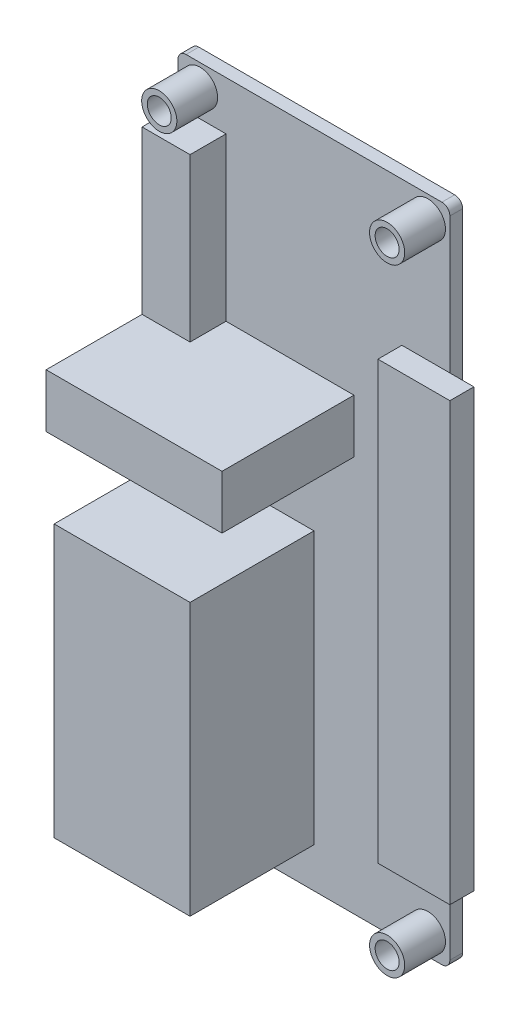
ISO-10303-21;
HEADER;
FILE_DESCRIPTION(('STEP AP214'),'2;1');
FILE_NAME('part.step','',(''),(''),'','','');
FILE_SCHEMA(('AUTOMOTIVE_DESIGN { 1 0 10303 214 1 1 1 1 }'));
ENDSEC;
DATA;
#1=APPLICATION_CONTEXT('core data for automotive mechanical design processes');
#2=APPLICATION_PROTOCOL_DEFINITION('international standard','automotive_design',2000,#1);
#3=PRODUCT_CONTEXT('',#1,'mechanical');
#4=PRODUCT('Part','Part','',(#3));
#5=PRODUCT_RELATED_PRODUCT_CATEGORY('part','',(#4));
#6=PRODUCT_DEFINITION_FORMATION('','',#4);
#7=PRODUCT_DEFINITION_CONTEXT('part definition',#1,'design');
#8=PRODUCT_DEFINITION('design','',#6,#7);
#9=PRODUCT_DEFINITION_SHAPE('','',#8);
#10=(LENGTH_UNIT() NAMED_UNIT(*) SI_UNIT(.MILLI.,.METRE.));
#11=(NAMED_UNIT(*) PLANE_ANGLE_UNIT() SI_UNIT($,.RADIAN.));
#12=(NAMED_UNIT(*) SI_UNIT($,.STERADIAN.) SOLID_ANGLE_UNIT());
#13=UNCERTAINTY_MEASURE_WITH_UNIT(LENGTH_MEASURE(1.E-05),#10,'distance_accuracy_value','');
#14=(GEOMETRIC_REPRESENTATION_CONTEXT(3) GLOBAL_UNCERTAINTY_ASSIGNED_CONTEXT((#13)) GLOBAL_UNIT_ASSIGNED_CONTEXT((#10,
#11,#12)) REPRESENTATION_CONTEXT('',''));
#15=CARTESIAN_POINT('',(0.,0.,0.));
#16=DIRECTION('',(0.,0.,1.));
#17=DIRECTION('',(1.,0.,0.));
#18=AXIS2_PLACEMENT_3D('',#15,#16,#17);
#19=CARTESIAN_POINT('',(16.,-40.3,1.6));
#20=DIRECTION('',(0.,0.,1.));
#21=DIRECTION('',(1.,0.,0.));
#22=AXIS2_PLACEMENT_3D('',#19,#20,#21);
#23=PLANE('',#22);
#24=CARTESIAN_POINT('',(-14.25,-38.6,1.6));
#25=DIRECTION('',(0.,0.,1.));
#26=DIRECTION('',(1.,0.,0.));
#27=AXIS2_PLACEMENT_3D('',#24,#25,#26);
#28=CIRCLE('',#27,2.2);
#29=CARTESIAN_POINT('',(-12.05,-38.6,1.6));
#30=VERTEX_POINT('',#29);
#31=EDGE_CURVE('E302',#30,#30,#28,.T.);
#32=ORIENTED_EDGE('',*,*,#31,.F.);
#33=EDGE_LOOP('',(#32));
#34=FACE_BOUND('',#33,.T.);
#35=CARTESIAN_POINT('',(-14.25,38.6,1.6));
#36=DIRECTION('',(0.,0.,1.));
#37=DIRECTION('',(1.,0.,0.));
#38=AXIS2_PLACEMENT_3D('',#35,#36,#37);
#39=CIRCLE('',#38,2.2);
#40=CARTESIAN_POINT('',(-12.05,38.6,1.6));
#41=VERTEX_POINT('',#40);
#42=EDGE_CURVE('E329',#41,#41,#39,.T.);
#43=ORIENTED_EDGE('',*,*,#42,.F.);
#44=EDGE_LOOP('',(#43));
#45=FACE_BOUND('',#44,.T.);
#46=CARTESIAN_POINT('',(14.25,38.6,1.6));
#47=DIRECTION('',(0.,0.,1.));
#48=DIRECTION('',(1.,0.,0.));
#49=AXIS2_PLACEMENT_3D('',#46,#47,#48);
#50=CIRCLE('',#49,2.2);
#51=CARTESIAN_POINT('',(16.45,38.6,1.6));
#52=VERTEX_POINT('',#51);
#53=EDGE_CURVE('E314',#52,#52,#50,.T.);
#54=ORIENTED_EDGE('',*,*,#53,.F.);
#55=EDGE_LOOP('',(#54));
#56=FACE_BOUND('',#55,.T.);
#57=CARTESIAN_POINT('',(14.25,-38.6,1.6));
#58=DIRECTION('',(0.,0.,1.));
#59=DIRECTION('',(1.,0.,0.));
#60=AXIS2_PLACEMENT_3D('',#57,#58,#59);
#61=CIRCLE('',#60,2.2);
#62=CARTESIAN_POINT('',(16.45,-38.6,1.6));
#63=VERTEX_POINT('',#62);
#64=EDGE_CURVE('E290',#63,#63,#61,.T.);
#65=ORIENTED_EDGE('',*,*,#64,.F.);
#66=EDGE_LOOP('',(#65));
#67=FACE_BOUND('',#66,.T.);
#68=DIRECTION('',(-1.,0.,0.));
#69=VECTOR('',#68,1.);
#70=CARTESIAN_POINT('',(-11.,35.2,1.6));
#71=LINE('',#70,#69);
#72=CARTESIAN_POINT('',(-11.,35.2,1.6));
#73=VERTEX_POINT('',#72);
#74=CARTESIAN_POINT('',(-17.,35.2,1.6));
#75=VERTEX_POINT('',#74);
#76=EDGE_CURVE('E238',#73,#75,#71,.T.);
#77=ORIENTED_EDGE('',*,*,#76,.F.);
#78=DIRECTION('',(0.,1.,0.));
#79=VECTOR('',#78,1.);
#80=CARTESIAN_POINT('',(-11.,14.9,1.6));
#81=LINE('',#80,#79);
#82=CARTESIAN_POINT('',(-11.,14.9,1.6));
#83=VERTEX_POINT('',#82);
#84=EDGE_CURVE('E242',#83,#73,#81,.T.);
#85=ORIENTED_EDGE('',*,*,#84,.F.);
#86=DIRECTION('',(-1.,0.,0.));
#87=VECTOR('',#86,1.);
#88=CARTESIAN_POINT('',(-17.,14.9,1.6));
#89=LINE('',#88,#87);
#90=CARTESIAN_POINT('',(5.,14.9,1.6));
#91=VERTEX_POINT('',#90);
#92=EDGE_CURVE('E260',#91,#83,#89,.T.);
#93=ORIENTED_EDGE('',*,*,#92,.F.);
#94=DIRECTION('',(0.,1.,0.));
#95=VECTOR('',#94,1.);
#96=CARTESIAN_POINT('',(5.,14.9,1.6));
#97=LINE('',#96,#95);
#98=CARTESIAN_POINT('',(5.,8.20000000000001,1.6));
#99=VERTEX_POINT('',#98);
#100=EDGE_CURVE('E249',#99,#91,#97,.T.);
#101=ORIENTED_EDGE('',*,*,#100,.F.);
#102=DIRECTION('',(1.,0.,0.));
#103=VECTOR('',#102,1.);
#104=CARTESIAN_POINT('',(-17.,8.20000000000001,1.6));
#105=LINE('',#104,#103);
#106=CARTESIAN_POINT('',(-10.,8.20000000000001,1.6));
#107=VERTEX_POINT('',#106);
#108=EDGE_CURVE('E245',#107,#99,#105,.T.);
#109=ORIENTED_EDGE('',*,*,#108,.F.);
#110=DIRECTION('',(0.,1.,0.));
#111=VECTOR('',#110,1.);
#112=CARTESIAN_POINT('',(-10.,8.20000000000001,1.6));
#113=LINE('',#112,#111);
#114=CARTESIAN_POINT('',(-10.,-2.3,1.6));
#115=VERTEX_POINT('',#114);
#116=EDGE_CURVE('E334',#115,#107,#113,.T.);
#117=ORIENTED_EDGE('',*,*,#116,.F.);
#118=DIRECTION('',(-1.,0.,0.));
#119=VECTOR('',#118,1.);
#120=CARTESIAN_POINT('',(-17.,-2.3,1.6));
#121=LINE('',#120,#119);
#122=CARTESIAN_POINT('',(0.,-2.3,1.6));
#123=VERTEX_POINT('',#122);
#124=EDGE_CURVE('E365',#123,#115,#121,.T.);
#125=ORIENTED_EDGE('',*,*,#124,.F.);
#126=DIRECTION('',(0.,1.,0.));
#127=VECTOR('',#126,1.);
#128=CARTESIAN_POINT('',(0.,-2.3,1.6));
#129=LINE('',#128,#127);
#130=CARTESIAN_POINT('',(0.,-36.3,1.6));
#131=VERTEX_POINT('',#130);
#132=EDGE_CURVE('E378',#131,#123,#129,.T.);
#133=ORIENTED_EDGE('',*,*,#132,.F.);
#134=DIRECTION('',(1.,0.,0.));
#135=VECTOR('',#134,1.);
#136=CARTESIAN_POINT('',(-17.,-36.3,1.6));
#137=LINE('',#136,#135);
#138=CARTESIAN_POINT('',(-17.,-36.3,1.6));
#139=VERTEX_POINT('',#138);
#140=EDGE_CURVE('E359',#139,#131,#137,.T.);
#141=ORIENTED_EDGE('',*,*,#140,.F.);
#142=DIRECTION('',(0.,-1.,0.));
#143=VECTOR('',#142,1.);
#144=CARTESIAN_POINT('',(-17.,-40.3,1.6));
#145=LINE('',#144,#143);
#146=CARTESIAN_POINT('',(-17.,-40.3,1.6));
#147=VERTEX_POINT('',#146);
#148=EDGE_CURVE('E479',#139,#147,#145,.T.);
#149=ORIENTED_EDGE('',*,*,#148,.T.);
#150=CARTESIAN_POINT('',(-16.,-40.3,1.6));
#151=DIRECTION('',(0.,0.,1.));
#152=DIRECTION('',(-1.,0.,0.));
#153=AXIS2_PLACEMENT_3D('',#150,#151,#152);
#154=CIRCLE('',#153,1.);
#155=CARTESIAN_POINT('',(-16.,-41.3,1.6));
#156=VERTEX_POINT('',#155);
#157=EDGE_CURVE('E484',#147,#156,#154,.T.);
#158=ORIENTED_EDGE('',*,*,#157,.T.);
#159=DIRECTION('',(1.,0.,0.));
#160=VECTOR('',#159,1.);
#161=CARTESIAN_POINT('',(-16.,-41.3,1.6));
#162=LINE('',#161,#160);
#163=CARTESIAN_POINT('',(16.,-41.3,1.6));
#164=VERTEX_POINT('',#163);
#165=EDGE_CURVE('E487',#156,#164,#162,.T.);
#166=ORIENTED_EDGE('',*,*,#165,.T.);
#167=CARTESIAN_POINT('',(16.,-40.3,1.6));
#168=DIRECTION('',(0.,0.,1.));
#169=DIRECTION('',(1.,0.,0.));
#170=AXIS2_PLACEMENT_3D('',#167,#168,#169);
#171=CIRCLE('',#170,1.);
#172=CARTESIAN_POINT('',(17.,-40.3,1.6));
#173=VERTEX_POINT('',#172);
#174=EDGE_CURVE('E460',#164,#173,#171,.T.);
#175=ORIENTED_EDGE('',*,*,#174,.T.);
#176=DIRECTION('',(0.,1.,0.));
#177=VECTOR('',#176,1.);
#178=CARTESIAN_POINT('',(17.,-40.3,1.6));
#179=LINE('',#178,#177);
#180=CARTESIAN_POINT('',(17.,-31.3,1.6));
#181=VERTEX_POINT('',#180);
#182=EDGE_CURVE('E466',#173,#181,#179,.T.);
#183=ORIENTED_EDGE('',*,*,#182,.T.);
#184=DIRECTION('',(1.,0.,0.));
#185=VECTOR('',#184,1.);
#186=CARTESIAN_POINT('',(11.,-31.3,1.6));
#187=LINE('',#186,#185);
#188=CARTESIAN_POINT('',(11.,-31.3,1.6));
#189=VERTEX_POINT('',#188);
#190=EDGE_CURVE('E419',#189,#181,#187,.T.);
#191=ORIENTED_EDGE('',*,*,#190,.F.);
#192=DIRECTION('',(0.,-1.,0.));
#193=VECTOR('',#192,1.);
#194=CARTESIAN_POINT('',(11.,23.3,1.6));
#195=LINE('',#194,#193);
#196=CARTESIAN_POINT('',(11.,23.3,1.6));
#197=VERTEX_POINT('',#196);
#198=EDGE_CURVE('E400',#197,#189,#195,.T.);
#199=ORIENTED_EDGE('',*,*,#198,.F.);
#200=DIRECTION('',(-1.,0.,0.));
#201=VECTOR('',#200,1.);
#202=CARTESIAN_POINT('',(11.,23.3,1.6));
#203=LINE('',#202,#201);
#204=CARTESIAN_POINT('',(17.,23.3,1.6));
#205=VERTEX_POINT('',#204);
#206=EDGE_CURVE('E11',#205,#197,#203,.T.);
#207=ORIENTED_EDGE('',*,*,#206,.F.);
#208=CARTESIAN_POINT('',(17.,40.3,1.6));
#209=VERTEX_POINT('',#208);
#210=EDGE_CURVE('E464',#205,#209,#179,.T.);
#211=ORIENTED_EDGE('',*,*,#210,.T.);
#212=CARTESIAN_POINT('',(16.,40.3,1.6));
#213=DIRECTION('',(0.,0.,1.));
#214=DIRECTION('',(-1.,0.,0.));
#215=AXIS2_PLACEMENT_3D('',#212,#213,#214);
#216=CIRCLE('',#215,1.);
#217=CARTESIAN_POINT('',(16.,41.3,1.6));
#218=VERTEX_POINT('',#217);
#219=EDGE_CURVE('E469',#209,#218,#216,.T.);
#220=ORIENTED_EDGE('',*,*,#219,.T.);
#221=DIRECTION('',(-1.,0.,0.));
#222=VECTOR('',#221,1.);
#223=CARTESIAN_POINT('',(-16.,41.3,1.6));
#224=LINE('',#223,#222);
#225=CARTESIAN_POINT('',(-16.,41.3,1.6));
#226=VERTEX_POINT('',#225);
#227=EDGE_CURVE('E473',#218,#226,#224,.T.);
#228=ORIENTED_EDGE('',*,*,#227,.T.);
#229=CARTESIAN_POINT('',(-16.,40.3,1.6));
#230=DIRECTION('',(0.,0.,1.));
#231=DIRECTION('',(-1.,0.,0.));
#232=AXIS2_PLACEMENT_3D('',#229,#230,#231);
#233=CIRCLE('',#232,1.);
#234=CARTESIAN_POINT('',(-17.,40.3,1.6));
#235=VERTEX_POINT('',#234);
#236=EDGE_CURVE('E476',#226,#235,#233,.T.);
#237=ORIENTED_EDGE('',*,*,#236,.T.);
#238=EDGE_CURVE('E480',#235,#75,#145,.T.);
#239=ORIENTED_EDGE('',*,*,#238,.T.);
#240=EDGE_LOOP('',(#77,#85,#93,#101,#109,#117,#125,#133,#141,#149,#158,#166,#175,#183,#191,#199,
#207,#211,#220,#228,#237,#239));
#241=FACE_BOUND('',#240,.T.);
#242=ADVANCED_FACE('F45',(#34,#45,#56,#67,#241),#23,.T.);
#243=CARTESIAN_POINT('',(-17.,14.9,18.1));
#244=DIRECTION('',(0.,-1.,0.));
#245=DIRECTION('',(0.,0.,-1.));
#246=AXIS2_PLACEMENT_3D('',#243,#244,#245);
#247=PLANE('',#246);
#248=DIRECTION('',(0.,0.,-1.));
#249=VECTOR('',#248,1.);
#250=CARTESIAN_POINT('',(-11.,14.9,6.1));
#251=LINE('',#250,#249);
#252=CARTESIAN_POINT('',(-11.,14.9,6.1));
#253=VERTEX_POINT('',#252);
#254=EDGE_CURVE('E251',#253,#83,#251,.T.);
#255=ORIENTED_EDGE('',*,*,#254,.F.);
#256=DIRECTION('',(1.,0.,0.));
#257=VECTOR('',#256,1.);
#258=CARTESIAN_POINT('',(-11.,14.9,6.1));
#259=LINE('',#258,#257);
#260=CARTESIAN_POINT('',(-17.,14.9,6.1));
#261=VERTEX_POINT('',#260);
#262=EDGE_CURVE('E234',#261,#253,#259,.T.);
#263=ORIENTED_EDGE('',*,*,#262,.F.);
#264=DIRECTION('',(0.,0.,-1.));
#265=VECTOR('',#264,1.);
#266=CARTESIAN_POINT('',(-17.,14.9,18.1));
#267=LINE('',#266,#265);
#268=CARTESIAN_POINT('',(-17.,14.9,18.1));
#269=VERTEX_POINT('',#268);
#270=EDGE_CURVE('E268',#269,#261,#267,.T.);
#271=ORIENTED_EDGE('',*,*,#270,.F.);
#272=DIRECTION('',(-1.,0.,0.));
#273=VECTOR('',#272,1.);
#274=CARTESIAN_POINT('',(-17.,14.9,18.1));
#275=LINE('',#274,#273);
#276=CARTESIAN_POINT('',(5.,14.9,18.1));
#277=VERTEX_POINT('',#276);
#278=EDGE_CURVE('E266',#277,#269,#275,.T.);
#279=ORIENTED_EDGE('',*,*,#278,.F.);
#280=DIRECTION('',(0.,0.,-1.));
#281=VECTOR('',#280,1.);
#282=CARTESIAN_POINT('',(5.,14.9,18.1));
#283=LINE('',#282,#281);
#284=EDGE_CURVE('E278',#277,#91,#283,.T.);
#285=ORIENTED_EDGE('',*,*,#284,.T.);
#286=ORIENTED_EDGE('',*,*,#92,.T.);
#287=EDGE_LOOP('',(#255,#263,#271,#279,#285,#286));
#288=FACE_BOUND('',#287,.T.);
#289=ADVANCED_FACE('F615',(#288),#247,.F.);
#290=CARTESIAN_POINT('',(-17.,-2.3,17.1));
#291=DIRECTION('',(0.,-1.,0.));
#292=DIRECTION('',(0.,0.,-1.));
#293=AXIS2_PLACEMENT_3D('',#290,#291,#292);
#294=PLANE('',#293);
#295=DIRECTION('',(0.,0.,-1.));
#296=VECTOR('',#295,1.);
#297=CARTESIAN_POINT('',(-10.,-2.3,5.1));
#298=LINE('',#297,#296);
#299=CARTESIAN_POINT('',(-10.,-2.3,5.1));
#300=VERTEX_POINT('',#299);
#301=EDGE_CURVE('E356',#300,#115,#298,.T.);
#302=ORIENTED_EDGE('',*,*,#301,.F.);
#303=DIRECTION('',(1.,0.,0.));
#304=VECTOR('',#303,1.);
#305=CARTESIAN_POINT('',(-17.,-2.3,5.1));
#306=LINE('',#305,#304);
#307=CARTESIAN_POINT('',(-17.,-2.3,5.1));
#308=VERTEX_POINT('',#307);
#309=EDGE_CURVE('E340',#308,#300,#306,.T.);
#310=ORIENTED_EDGE('',*,*,#309,.F.);
#311=DIRECTION('',(0.,0.,-1.));
#312=VECTOR('',#311,1.);
#313=CARTESIAN_POINT('',(-17.,-2.3,17.1));
#314=LINE('',#313,#312);
#315=CARTESIAN_POINT('',(-17.,-2.3,17.1));
#316=VERTEX_POINT('',#315);
#317=EDGE_CURVE('E374',#316,#308,#314,.T.);
#318=ORIENTED_EDGE('',*,*,#317,.F.);
#319=DIRECTION('',(-1.,0.,0.));
#320=VECTOR('',#319,1.);
#321=CARTESIAN_POINT('',(-17.,-2.3,17.1));
#322=LINE('',#321,#320);
#323=CARTESIAN_POINT('',(0.,-2.3,17.1));
#324=VERTEX_POINT('',#323);
#325=EDGE_CURVE('E371',#324,#316,#322,.T.);
#326=ORIENTED_EDGE('',*,*,#325,.F.);
#327=DIRECTION('',(0.,0.,-1.));
#328=VECTOR('',#327,1.);
#329=CARTESIAN_POINT('',(0.,-2.3,17.1));
#330=LINE('',#329,#328);
#331=EDGE_CURVE('E388',#324,#123,#330,.T.);
#332=ORIENTED_EDGE('',*,*,#331,.T.);
#333=ORIENTED_EDGE('',*,*,#124,.T.);
#334=EDGE_LOOP('',(#302,#310,#318,#326,#332,#333));
#335=FACE_BOUND('',#334,.T.);
#336=ADVANCED_FACE('F623',(#335),#294,.F.);
#337=CARTESIAN_POINT('',(16.,-40.3,0.));
#338=DIRECTION('',(0.,0.,1.));
#339=DIRECTION('',(1.,0.,0.));
#340=AXIS2_PLACEMENT_3D('',#337,#338,#339);
#341=PLANE('',#340);
#342=CARTESIAN_POINT('',(16.,-40.3,0.));
#343=DIRECTION('',(0.,0.,1.));
#344=DIRECTION('',(1.,0.,0.));
#345=AXIS2_PLACEMENT_3D('',#342,#343,#344);
#346=CIRCLE('',#345,1.);
#347=CARTESIAN_POINT('',(16.,-41.3,0.));
#348=VERTEX_POINT('',#347);
#349=CARTESIAN_POINT('',(17.,-40.3,0.));
#350=VERTEX_POINT('',#349);
#351=EDGE_CURVE('E459',#348,#350,#346,.T.);
#352=ORIENTED_EDGE('',*,*,#351,.F.);
#353=DIRECTION('',(1.,0.,0.));
#354=VECTOR('',#353,1.);
#355=CARTESIAN_POINT('',(-16.,-41.3,0.));
#356=LINE('',#355,#354);
#357=CARTESIAN_POINT('',(-16.,-41.3,0.));
#358=VERTEX_POINT('',#357);
#359=EDGE_CURVE('E465',#358,#348,#356,.T.);
#360=ORIENTED_EDGE('',*,*,#359,.F.);
#361=CARTESIAN_POINT('',(-16.,-40.3,0.));
#362=DIRECTION('',(0.,0.,1.));
#363=DIRECTION('',(-1.,0.,0.));
#364=AXIS2_PLACEMENT_3D('',#361,#362,#363);
#365=CIRCLE('',#364,1.);
#366=CARTESIAN_POINT('',(-17.,-40.3,0.));
#367=VERTEX_POINT('',#366);
#368=EDGE_CURVE('E509',#367,#358,#365,.T.);
#369=ORIENTED_EDGE('',*,*,#368,.F.);
#370=DIRECTION('',(0.,-1.,0.));
#371=VECTOR('',#370,1.);
#372=CARTESIAN_POINT('',(-17.,-40.3,0.));
#373=LINE('',#372,#371);
#374=CARTESIAN_POINT('',(-17.,40.3,0.));
#375=VERTEX_POINT('',#374);
#376=EDGE_CURVE('E506',#375,#367,#373,.T.);
#377=ORIENTED_EDGE('',*,*,#376,.F.);
#378=CARTESIAN_POINT('',(-16.,40.3,0.));
#379=DIRECTION('',(0.,0.,1.));
#380=DIRECTION('',(-1.,0.,0.));
#381=AXIS2_PLACEMENT_3D('',#378,#379,#380);
#382=CIRCLE('',#381,1.);
#383=CARTESIAN_POINT('',(-16.,41.3,0.));
#384=VERTEX_POINT('',#383);
#385=EDGE_CURVE('E503',#384,#375,#382,.T.);
#386=ORIENTED_EDGE('',*,*,#385,.F.);
#387=DIRECTION('',(-1.,0.,0.));
#388=VECTOR('',#387,1.);
#389=CARTESIAN_POINT('',(-16.,41.3,0.));
#390=LINE('',#389,#388);
#391=CARTESIAN_POINT('',(16.,41.3,0.));
#392=VERTEX_POINT('',#391);
#393=EDGE_CURVE('E500',#392,#384,#390,.T.);
#394=ORIENTED_EDGE('',*,*,#393,.F.);
#395=CARTESIAN_POINT('',(16.,40.3,0.));
#396=DIRECTION('',(0.,0.,1.));
#397=DIRECTION('',(-1.,0.,0.));
#398=AXIS2_PLACEMENT_3D('',#395,#396,#397);
#399=CIRCLE('',#398,1.);
#400=CARTESIAN_POINT('',(17.,40.3,0.));
#401=VERTEX_POINT('',#400);
#402=EDGE_CURVE('E497',#401,#392,#399,.T.);
#403=ORIENTED_EDGE('',*,*,#402,.F.);
#404=DIRECTION('',(0.,1.,0.));
#405=VECTOR('',#404,1.);
#406=CARTESIAN_POINT('',(17.,-40.3,0.));
#407=LINE('',#406,#405);
#408=EDGE_CURVE('E494',#350,#401,#407,.T.);
#409=ORIENTED_EDGE('',*,*,#408,.F.);
#410=EDGE_LOOP('',(#352,#360,#369,#377,#386,#394,#403,#409));
#411=FACE_BOUND('',#410,.T.);
#412=CARTESIAN_POINT('',(-14.25,38.6,0.));
#413=DIRECTION('',(0.,0.,1.));
#414=DIRECTION('',(1.,0.,0.));
#415=AXIS2_PLACEMENT_3D('',#412,#413,#414);
#416=CIRCLE('',#415,1.5);
#417=CARTESIAN_POINT('',(-12.75,38.6,0.));
#418=VERTEX_POINT('',#417);
#419=EDGE_CURVE('E455',#418,#418,#416,.T.);
#420=ORIENTED_EDGE('',*,*,#419,.T.);
#421=EDGE_LOOP('',(#420));
#422=FACE_BOUND('',#421,.T.);
#423=CARTESIAN_POINT('',(14.25,38.6,0.));
#424=DIRECTION('',(0.,0.,1.));
#425=DIRECTION('',(1.,0.,0.));
#426=AXIS2_PLACEMENT_3D('',#423,#424,#425);
#427=CIRCLE('',#426,1.5);
#428=CARTESIAN_POINT('',(15.75,38.6,0.));
#429=VERTEX_POINT('',#428);
#430=EDGE_CURVE('E451',#429,#429,#427,.T.);
#431=ORIENTED_EDGE('',*,*,#430,.T.);
#432=EDGE_LOOP('',(#431));
#433=FACE_BOUND('',#432,.T.);
#434=CARTESIAN_POINT('',(-14.25,-38.6,0.));
#435=DIRECTION('',(0.,0.,1.));
#436=DIRECTION('',(1.,0.,0.));
#437=AXIS2_PLACEMENT_3D('',#434,#435,#436);
#438=CIRCLE('',#437,1.5);
#439=CARTESIAN_POINT('',(-12.75,-38.6,0.));
#440=VERTEX_POINT('',#439);
#441=EDGE_CURVE('E447',#440,#440,#438,.T.);
#442=ORIENTED_EDGE('',*,*,#441,.T.);
#443=EDGE_LOOP('',(#442));
#444=FACE_BOUND('',#443,.T.);
#445=CARTESIAN_POINT('',(14.25,-38.6,0.));
#446=DIRECTION('',(0.,0.,1.));
#447=DIRECTION('',(1.,0.,0.));
#448=AXIS2_PLACEMENT_3D('',#445,#446,#447);
#449=CIRCLE('',#448,1.5);
#450=CARTESIAN_POINT('',(15.75,-38.6,0.));
#451=VERTEX_POINT('',#450);
#452=EDGE_CURVE('E443',#451,#451,#449,.T.);
#453=ORIENTED_EDGE('',*,*,#452,.T.);
#454=EDGE_LOOP('',(#453));
#455=FACE_BOUND('',#454,.T.);
#456=ADVANCED_FACE('F555',(#411,#422,#433,#444,#455),#341,.F.);
#457=CARTESIAN_POINT('',(16.,-40.3,1.6));
#458=DIRECTION('',(0.,0.,-1.));
#459=DIRECTION('',(-1.,0.,0.));
#460=AXIS2_PLACEMENT_3D('',#457,#458,#459);
#461=CYLINDRICAL_SURFACE('',#460,1.);
#462=ORIENTED_EDGE('',*,*,#351,.T.);
#463=DIRECTION('',(0.,0.,-1.));
#464=VECTOR('',#463,1.);
#465=CARTESIAN_POINT('',(17.,-40.3,1.6));
#466=LINE('',#465,#464);
#467=EDGE_CURVE('E49',#173,#350,#466,.T.);
#468=ORIENTED_EDGE('',*,*,#467,.F.);
#469=ORIENTED_EDGE('',*,*,#174,.F.);
#470=DIRECTION('',(0.,0.,-1.));
#471=VECTOR('',#470,1.);
#472=CARTESIAN_POINT('',(16.,-41.3,1.6));
#473=LINE('',#472,#471);
#474=EDGE_CURVE('E490',#164,#348,#473,.T.);
#475=ORIENTED_EDGE('',*,*,#474,.T.);
#476=EDGE_LOOP('',(#462,#468,#469,#475));
#477=FACE_BOUND('',#476,.T.);
#478=ADVANCED_FACE('F47',(#477),#461,.T.);
#479=CARTESIAN_POINT('',(17.,-40.3,1.6));
#480=DIRECTION('',(-1.,0.,0.));
#481=DIRECTION('',(0.,0.,1.));
#482=AXIS2_PLACEMENT_3D('',#479,#480,#481);
#483=PLANE('',#482);
#484=ORIENTED_EDGE('',*,*,#408,.T.);
#485=DIRECTION('',(0.,0.,-1.));
#486=VECTOR('',#485,1.);
#487=CARTESIAN_POINT('',(17.,40.3,1.6));
#488=LINE('',#487,#486);
#489=EDGE_CURVE('E536',#209,#401,#488,.T.);
#490=ORIENTED_EDGE('',*,*,#489,.F.);
#491=ORIENTED_EDGE('',*,*,#210,.F.);
#492=EDGE_CURVE('E470',#181,#205,#179,.T.);
#493=ORIENTED_EDGE('',*,*,#492,.F.);
#494=ORIENTED_EDGE('',*,*,#182,.F.);
#495=ORIENTED_EDGE('',*,*,#467,.T.);
#496=EDGE_LOOP('',(#484,#490,#491,#493,#494,#495));
#497=FACE_BOUND('',#496,.T.);
#498=ADVANCED_FACE('F547',(#497),#483,.F.);
#499=CARTESIAN_POINT('',(16.,40.3,1.6));
#500=DIRECTION('',(0.,0.,-1.));
#501=DIRECTION('',(-1.,0.,0.));
#502=AXIS2_PLACEMENT_3D('',#499,#500,#501);
#503=CYLINDRICAL_SURFACE('',#502,1.);
#504=ORIENTED_EDGE('',*,*,#402,.T.);
#505=DIRECTION('',(0.,0.,-1.));
#506=VECTOR('',#505,1.);
#507=CARTESIAN_POINT('',(16.,41.3,1.6));
#508=LINE('',#507,#506);
#509=EDGE_CURVE('E533',#218,#392,#508,.T.);
#510=ORIENTED_EDGE('',*,*,#509,.F.);
#511=ORIENTED_EDGE('',*,*,#219,.F.);
#512=ORIENTED_EDGE('',*,*,#489,.T.);
#513=EDGE_LOOP('',(#504,#510,#511,#512));
#514=FACE_BOUND('',#513,.T.);
#515=ADVANCED_FACE('F561',(#514),#503,.T.);
#516=CARTESIAN_POINT('',(-16.,41.3,1.6));
#517=DIRECTION('',(0.,-1.,0.));
#518=DIRECTION('',(0.,0.,-1.));
#519=AXIS2_PLACEMENT_3D('',#516,#517,#518);
#520=PLANE('',#519);
#521=ORIENTED_EDGE('',*,*,#393,.T.);
#522=DIRECTION('',(0.,0.,-1.));
#523=VECTOR('',#522,1.);
#524=CARTESIAN_POINT('',(-16.,41.3,1.6));
#525=LINE('',#524,#523);
#526=EDGE_CURVE('E529',#226,#384,#525,.T.);
#527=ORIENTED_EDGE('',*,*,#526,.F.);
#528=ORIENTED_EDGE('',*,*,#227,.F.);
#529=ORIENTED_EDGE('',*,*,#509,.T.);
#530=EDGE_LOOP('',(#521,#527,#528,#529));
#531=FACE_BOUND('',#530,.T.);
#532=ADVANCED_FACE('F564',(#531),#520,.F.);
#533=CARTESIAN_POINT('',(-16.,40.3,1.6));
#534=DIRECTION('',(0.,0.,-1.));
#535=DIRECTION('',(-1.,0.,0.));
#536=AXIS2_PLACEMENT_3D('',#533,#534,#535);
#537=CYLINDRICAL_SURFACE('',#536,1.);
#538=ORIENTED_EDGE('',*,*,#385,.T.);
#539=DIRECTION('',(0.,0.,-1.));
#540=VECTOR('',#539,1.);
#541=CARTESIAN_POINT('',(-17.,40.3,1.6));
#542=LINE('',#541,#540);
#543=EDGE_CURVE('E525',#235,#375,#542,.T.);
#544=ORIENTED_EDGE('',*,*,#543,.F.);
#545=ORIENTED_EDGE('',*,*,#236,.F.);
#546=ORIENTED_EDGE('',*,*,#526,.T.);
#547=EDGE_LOOP('',(#538,#544,#545,#546));
#548=FACE_BOUND('',#547,.T.);
#549=ADVANCED_FACE('F604',(#548),#537,.T.);
#550=CARTESIAN_POINT('',(-17.,-40.3,1.6));
#551=DIRECTION('',(1.,0.,0.));
#552=DIRECTION('',(0.,0.,-1.));
#553=AXIS2_PLACEMENT_3D('',#550,#551,#552);
#554=PLANE('',#553);
#555=ORIENTED_EDGE('',*,*,#376,.T.);
#556=DIRECTION('',(0.,0.,-1.));
#557=VECTOR('',#556,1.);
#558=CARTESIAN_POINT('',(-17.,-40.3,1.6));
#559=LINE('',#558,#557);
#560=EDGE_CURVE('E521',#147,#367,#559,.T.);
#561=ORIENTED_EDGE('',*,*,#560,.F.);
#562=ORIENTED_EDGE('',*,*,#148,.F.);
#563=DIRECTION('',(0.,0.,-1.));
#564=VECTOR('',#563,1.);
#565=CARTESIAN_POINT('',(-17.,-36.3,17.1));
#566=LINE('',#565,#564);
#567=CARTESIAN_POINT('',(-17.,-36.3,17.1));
#568=VERTEX_POINT('',#567);
#569=EDGE_CURVE('E396',#568,#139,#566,.T.);
#570=ORIENTED_EDGE('',*,*,#569,.F.);
#571=DIRECTION('',(0.,-1.,0.));
#572=VECTOR('',#571,1.);
#573=CARTESIAN_POINT('',(-17.,-2.3,17.1));
#574=LINE('',#573,#572);
#575=EDGE_CURVE('E360',#316,#568,#574,.T.);
#576=ORIENTED_EDGE('',*,*,#575,.F.);
#577=ORIENTED_EDGE('',*,*,#317,.T.);
#578=DIRECTION('',(0.,-1.,0.));
#579=VECTOR('',#578,1.);
#580=CARTESIAN_POINT('',(-17.,8.20000000000001,5.1));
#581=LINE('',#580,#579);
#582=CARTESIAN_POINT('',(-17.,8.20000000000001,5.1));
#583=VERTEX_POINT('',#582);
#584=EDGE_CURVE('E71',#583,#308,#581,.T.);
#585=ORIENTED_EDGE('',*,*,#584,.F.);
#586=DIRECTION('',(0.,0.,-1.));
#587=VECTOR('',#586,1.);
#588=CARTESIAN_POINT('',(-17.,8.20000000000001,18.1));
#589=LINE('',#588,#587);
#590=CARTESIAN_POINT('',(-17.,8.20000000000001,18.1));
#591=VERTEX_POINT('',#590);
#592=EDGE_CURVE('E286',#591,#583,#589,.T.);
#593=ORIENTED_EDGE('',*,*,#592,.F.);
#594=DIRECTION('',(0.,-1.,0.));
#595=VECTOR('',#594,1.);
#596=CARTESIAN_POINT('',(-17.,14.9,18.1));
#597=LINE('',#596,#595);
#598=EDGE_CURVE('E255',#269,#591,#597,.T.);
#599=ORIENTED_EDGE('',*,*,#598,.F.);
#600=ORIENTED_EDGE('',*,*,#270,.T.);
#601=DIRECTION('',(0.,-1.,0.));
#602=VECTOR('',#601,1.);
#603=CARTESIAN_POINT('',(-17.,14.9,6.1));
#604=LINE('',#603,#602);
#605=CARTESIAN_POINT('',(-17.,35.2,6.1));
#606=VERTEX_POINT('',#605);
#607=EDGE_CURVE('E63',#606,#261,#604,.T.);
#608=ORIENTED_EDGE('',*,*,#607,.F.);
#609=DIRECTION('',(0.,0.,-1.));
#610=VECTOR('',#609,1.);
#611=CARTESIAN_POINT('',(-17.,35.2,6.1));
#612=LINE('',#611,#610);
#613=EDGE_CURVE('E228',#606,#75,#612,.T.);
#614=ORIENTED_EDGE('',*,*,#613,.T.);
#615=ORIENTED_EDGE('',*,*,#238,.F.);
#616=ORIENTED_EDGE('',*,*,#543,.T.);
#617=EDGE_LOOP('',(#555,#561,#562,#570,#576,#577,#585,#593,#599,#600,#608,#614,#615,#616));
#618=FACE_BOUND('',#617,.T.);
#619=ADVANCED_FACE('F601',(#618),#554,.F.);
#620=CARTESIAN_POINT('',(-16.,-40.3,1.6));
#621=DIRECTION('',(0.,0.,-1.));
#622=DIRECTION('',(-1.,0.,0.));
#623=AXIS2_PLACEMENT_3D('',#620,#621,#622);
#624=CYLINDRICAL_SURFACE('',#623,1.);
#625=ORIENTED_EDGE('',*,*,#368,.T.);
#626=DIRECTION('',(0.,0.,-1.));
#627=VECTOR('',#626,1.);
#628=CARTESIAN_POINT('',(-16.,-41.3,1.6));
#629=LINE('',#628,#627);
#630=EDGE_CURVE('E517',#156,#358,#629,.T.);
#631=ORIENTED_EDGE('',*,*,#630,.F.);
#632=ORIENTED_EDGE('',*,*,#157,.F.);
#633=ORIENTED_EDGE('',*,*,#560,.T.);
#634=EDGE_LOOP('',(#625,#631,#632,#633));
#635=FACE_BOUND('',#634,.T.);
#636=ADVANCED_FACE('F597',(#635),#624,.T.);
#637=CARTESIAN_POINT('',(-16.,-41.3,1.6));
#638=DIRECTION('',(0.,1.,0.));
#639=DIRECTION('',(0.,0.,1.));
#640=AXIS2_PLACEMENT_3D('',#637,#638,#639);
#641=PLANE('',#640);
#642=ORIENTED_EDGE('',*,*,#359,.T.);
#643=ORIENTED_EDGE('',*,*,#474,.F.);
#644=ORIENTED_EDGE('',*,*,#165,.F.);
#645=ORIENTED_EDGE('',*,*,#630,.T.);
#646=EDGE_LOOP('',(#642,#643,#644,#645));
#647=FACE_BOUND('',#646,.T.);
#648=ADVANCED_FACE('F595',(#647),#641,.F.);
#649=CARTESIAN_POINT('',(-14.25,38.6,1.6));
#650=DIRECTION('',(0.,0.,-1.));
#651=DIRECTION('',(-1.,0.,0.));
#652=AXIS2_PLACEMENT_3D('',#649,#650,#651);
#653=CYLINDRICAL_SURFACE('',#652,1.5);
#654=ORIENTED_EDGE('',*,*,#419,.F.);
#655=EDGE_LOOP('',(#654));
#656=FACE_BOUND('',#655,.T.);
#657=CARTESIAN_POINT('',(-14.25,38.6,6.7));
#658=DIRECTION('',(0.,0.,1.));
#659=DIRECTION('',(1.,0.,0.));
#660=AXIS2_PLACEMENT_3D('',#657,#658,#659);
#661=CIRCLE('',#660,1.5);
#662=CARTESIAN_POINT('',(-12.75,38.6,6.7));
#663=VERTEX_POINT('',#662);
#664=EDGE_CURVE('E325',#663,#663,#661,.T.);
#665=ORIENTED_EDGE('',*,*,#664,.T.);
#666=EDGE_LOOP('',(#665));
#667=FACE_BOUND('',#666,.T.);
#668=ADVANCED_FACE('F630',(#656,#667),#653,.F.);
#669=CARTESIAN_POINT('',(14.25,38.6,1.6));
#670=DIRECTION('',(0.,0.,-1.));
#671=DIRECTION('',(-1.,0.,0.));
#672=AXIS2_PLACEMENT_3D('',#669,#670,#671);
#673=CYLINDRICAL_SURFACE('',#672,1.5);
#674=ORIENTED_EDGE('',*,*,#430,.F.);
#675=EDGE_LOOP('',(#674));
#676=FACE_BOUND('',#675,.T.);
#677=CARTESIAN_POINT('',(14.25,38.6,6.7));
#678=DIRECTION('',(0.,0.,1.));
#679=DIRECTION('',(1.,0.,0.));
#680=AXIS2_PLACEMENT_3D('',#677,#678,#679);
#681=CIRCLE('',#680,1.5);
#682=CARTESIAN_POINT('',(15.75,38.6,6.7));
#683=VERTEX_POINT('',#682);
#684=EDGE_CURVE('E318',#683,#683,#681,.T.);
#685=ORIENTED_EDGE('',*,*,#684,.T.);
#686=EDGE_LOOP('',(#685));
#687=FACE_BOUND('',#686,.T.);
#688=ADVANCED_FACE('F649',(#676,#687),#673,.F.);
#689=CARTESIAN_POINT('',(-14.25,-38.6,1.6));
#690=DIRECTION('',(0.,0.,-1.));
#691=DIRECTION('',(-1.,0.,0.));
#692=AXIS2_PLACEMENT_3D('',#689,#690,#691);
#693=CYLINDRICAL_SURFACE('',#692,1.5);
#694=ORIENTED_EDGE('',*,*,#441,.F.);
#695=EDGE_LOOP('',(#694));
#696=FACE_BOUND('',#695,.T.);
#697=CARTESIAN_POINT('',(-14.25,-38.6,6.7));
#698=DIRECTION('',(0.,0.,1.));
#699=DIRECTION('',(1.,0.,0.));
#700=AXIS2_PLACEMENT_3D('',#697,#698,#699);
#701=CIRCLE('',#700,1.5);
#702=CARTESIAN_POINT('',(-12.75,-38.6,6.7));
#703=VERTEX_POINT('',#702);
#704=EDGE_CURVE('E306',#703,#703,#701,.T.);
#705=ORIENTED_EDGE('',*,*,#704,.T.);
#706=EDGE_LOOP('',(#705));
#707=FACE_BOUND('',#706,.T.);
#708=ADVANCED_FACE('F657',(#696,#707),#693,.F.);
#709=CARTESIAN_POINT('',(14.25,-38.6,1.6));
#710=DIRECTION('',(0.,0.,-1.));
#711=DIRECTION('',(-1.,0.,0.));
#712=AXIS2_PLACEMENT_3D('',#709,#710,#711);
#713=CYLINDRICAL_SURFACE('',#712,1.5);
#714=ORIENTED_EDGE('',*,*,#452,.F.);
#715=EDGE_LOOP('',(#714));
#716=FACE_BOUND('',#715,.T.);
#717=CARTESIAN_POINT('',(14.25,-38.6,6.7));
#718=DIRECTION('',(0.,0.,1.));
#719=DIRECTION('',(1.,0.,0.));
#720=AXIS2_PLACEMENT_3D('',#717,#718,#719);
#721=CIRCLE('',#720,1.5);
#722=CARTESIAN_POINT('',(15.75,-38.6,6.7));
#723=VERTEX_POINT('',#722);
#724=EDGE_CURVE('E294',#723,#723,#721,.T.);
#725=ORIENTED_EDGE('',*,*,#724,.T.);
#726=EDGE_LOOP('',(#725));
#727=FACE_BOUND('',#726,.T.);
#728=ADVANCED_FACE('F664',(#716,#727),#713,.F.);
#729=CARTESIAN_POINT('',(0.,0.,1.6));
#730=DIRECTION('',(0.,0.,1.));
#731=DIRECTION('',(1.,0.,0.));
#732=AXIS2_PLACEMENT_3D('',#729,#730,#731);
#733=PLANE('',#732);
#734=CARTESIAN_POINT('',(20.,-31.3,1.6));
#735=VERTEX_POINT('',#734);
#736=EDGE_CURVE('E418',#181,#735,#187,.T.);
#737=ORIENTED_EDGE('',*,*,#736,.F.);
#738=ORIENTED_EDGE('',*,*,#492,.T.);
#739=CARTESIAN_POINT('',(20.,23.3,1.6));
#740=VERTEX_POINT('',#739);
#741=EDGE_CURVE('E56',#740,#205,#203,.T.);
#742=ORIENTED_EDGE('',*,*,#741,.F.);
#743=DIRECTION('',(0.,1.,0.));
#744=VECTOR('',#743,1.);
#745=CARTESIAN_POINT('',(20.,23.3,1.6));
#746=LINE('',#745,#744);
#747=EDGE_CURVE('E423',#735,#740,#746,.T.);
#748=ORIENTED_EDGE('',*,*,#747,.F.);
#749=EDGE_LOOP('',(#737,#738,#742,#748));
#750=FACE_BOUND('',#749,.T.);
#751=ADVANCED_FACE('F576',(#750),#733,.F.);
#752=CARTESIAN_POINT('',(11.,23.3,4.6));
#753=DIRECTION('',(1.,0.,0.));
#754=DIRECTION('',(0.,1.,0.));
#755=AXIS2_PLACEMENT_3D('',#752,#753,#754);
#756=PLANE('',#755);
#757=ORIENTED_EDGE('',*,*,#198,.T.);
#758=DIRECTION('',(0.,0.,-1.));
#759=VECTOR('',#758,1.);
#760=CARTESIAN_POINT('',(11.,-31.3,4.6));
#761=LINE('',#760,#759);
#762=CARTESIAN_POINT('',(11.,-31.3,4.6));
#763=VERTEX_POINT('',#762);
#764=EDGE_CURVE('E439',#763,#189,#761,.T.);
#765=ORIENTED_EDGE('',*,*,#764,.F.);
#766=DIRECTION('',(0.,-1.,0.));
#767=VECTOR('',#766,1.);
#768=CARTESIAN_POINT('',(11.,23.3,4.6));
#769=LINE('',#768,#767);
#770=CARTESIAN_POINT('',(11.,23.3,4.6));
#771=VERTEX_POINT('',#770);
#772=EDGE_CURVE('E401',#771,#763,#769,.T.);
#773=ORIENTED_EDGE('',*,*,#772,.F.);
#774=DIRECTION('',(0.,0.,-1.));
#775=VECTOR('',#774,1.);
#776=CARTESIAN_POINT('',(11.,23.3,4.6));
#777=LINE('',#776,#775);
#778=EDGE_CURVE('E414',#771,#197,#777,.T.);
#779=ORIENTED_EDGE('',*,*,#778,.T.);
#780=EDGE_LOOP('',(#757,#765,#773,#779));
#781=FACE_BOUND('',#780,.T.);
#782=ADVANCED_FACE('F680',(#781),#756,.F.);
#783=CARTESIAN_POINT('',(11.,-31.3,4.6));
#784=DIRECTION('',(0.,1.,0.));
#785=DIRECTION('',(0.,0.,1.));
#786=AXIS2_PLACEMENT_3D('',#783,#784,#785);
#787=PLANE('',#786);
#788=ORIENTED_EDGE('',*,*,#190,.T.);
#789=ORIENTED_EDGE('',*,*,#736,.T.);
#790=DIRECTION('',(0.,0.,-1.));
#791=VECTOR('',#790,1.);
#792=CARTESIAN_POINT('',(20.,-31.3,4.6));
#793=LINE('',#792,#791);
#794=CARTESIAN_POINT('',(20.,-31.3,4.6));
#795=VERTEX_POINT('',#794);
#796=EDGE_CURVE('E435',#795,#735,#793,.T.);
#797=ORIENTED_EDGE('',*,*,#796,.F.);
#798=DIRECTION('',(1.,0.,0.));
#799=VECTOR('',#798,1.);
#800=CARTESIAN_POINT('',(11.,-31.3,4.6));
#801=LINE('',#800,#799);
#802=EDGE_CURVE('E405',#763,#795,#801,.T.);
#803=ORIENTED_EDGE('',*,*,#802,.F.);
#804=ORIENTED_EDGE('',*,*,#764,.T.);
#805=EDGE_LOOP('',(#788,#789,#797,#803,#804));
#806=FACE_BOUND('',#805,.T.);
#807=ADVANCED_FACE('F588',(#806),#787,.F.);
#808=CARTESIAN_POINT('',(20.,23.3,4.6));
#809=DIRECTION('',(-1.,0.,0.));
#810=DIRECTION('',(0.,-1.,0.));
#811=AXIS2_PLACEMENT_3D('',#808,#809,#810);
#812=PLANE('',#811);
#813=ORIENTED_EDGE('',*,*,#747,.T.);
#814=DIRECTION('',(0.,0.,-1.));
#815=VECTOR('',#814,1.);
#816=CARTESIAN_POINT('',(20.,23.3,4.6));
#817=LINE('',#816,#815);
#818=CARTESIAN_POINT('',(20.,23.3,4.6));
#819=VERTEX_POINT('',#818);
#820=EDGE_CURVE('E431',#819,#740,#817,.T.);
#821=ORIENTED_EDGE('',*,*,#820,.F.);
#822=DIRECTION('',(0.,1.,0.));
#823=VECTOR('',#822,1.);
#824=CARTESIAN_POINT('',(20.,23.3,4.6));
#825=LINE('',#824,#823);
#826=EDGE_CURVE('E408',#795,#819,#825,.T.);
#827=ORIENTED_EDGE('',*,*,#826,.F.);
#828=ORIENTED_EDGE('',*,*,#796,.T.);
#829=EDGE_LOOP('',(#813,#821,#827,#828));
#830=FACE_BOUND('',#829,.T.);
#831=ADVANCED_FACE('F585',(#830),#812,.F.);
#832=CARTESIAN_POINT('',(11.,23.3,4.6));
#833=DIRECTION('',(0.,-1.,0.));
#834=DIRECTION('',(0.,0.,-1.));
#835=AXIS2_PLACEMENT_3D('',#832,#833,#834);
#836=PLANE('',#835);
#837=ORIENTED_EDGE('',*,*,#741,.T.);
#838=ORIENTED_EDGE('',*,*,#206,.T.);
#839=ORIENTED_EDGE('',*,*,#778,.F.);
#840=DIRECTION('',(-1.,0.,0.));
#841=VECTOR('',#840,1.);
#842=CARTESIAN_POINT('',(11.,23.3,4.6));
#843=LINE('',#842,#841);
#844=EDGE_CURVE('E411',#819,#771,#843,.T.);
#845=ORIENTED_EDGE('',*,*,#844,.F.);
#846=ORIENTED_EDGE('',*,*,#820,.T.);
#847=EDGE_LOOP('',(#837,#838,#839,#845,#846));
#848=FACE_BOUND('',#847,.T.);
#849=ADVANCED_FACE('F579',(#848),#836,.F.);
#850=CARTESIAN_POINT('',(0.,0.,4.6));
#851=DIRECTION('',(0.,0.,1.));
#852=DIRECTION('',(1.,0.,0.));
#853=AXIS2_PLACEMENT_3D('',#850,#851,#852);
#854=PLANE('',#853);
#855=ORIENTED_EDGE('',*,*,#772,.T.);
#856=ORIENTED_EDGE('',*,*,#802,.T.);
#857=ORIENTED_EDGE('',*,*,#826,.T.);
#858=ORIENTED_EDGE('',*,*,#844,.T.);
#859=EDGE_LOOP('',(#855,#856,#857,#858));
#860=FACE_BOUND('',#859,.T.);
#861=ADVANCED_FACE('F706',(#860),#854,.T.);
#862=CARTESIAN_POINT('',(-17.,-36.3,17.1));
#863=DIRECTION('',(0.,1.,0.));
#864=DIRECTION('',(0.,0.,1.));
#865=AXIS2_PLACEMENT_3D('',#862,#863,#864);
#866=PLANE('',#865);
#867=ORIENTED_EDGE('',*,*,#140,.T.);
#868=DIRECTION('',(0.,0.,-1.));
#869=VECTOR('',#868,1.);
#870=CARTESIAN_POINT('',(0.,-36.3,17.1));
#871=LINE('',#870,#869);
#872=CARTESIAN_POINT('',(0.,-36.3,17.1));
#873=VERTEX_POINT('',#872);
#874=EDGE_CURVE('E392',#873,#131,#871,.T.);
#875=ORIENTED_EDGE('',*,*,#874,.F.);
#876=DIRECTION('',(1.,0.,0.));
#877=VECTOR('',#876,1.);
#878=CARTESIAN_POINT('',(-17.,-36.3,17.1));
#879=LINE('',#878,#877);
#880=EDGE_CURVE('E364',#568,#873,#879,.T.);
#881=ORIENTED_EDGE('',*,*,#880,.F.);
#882=ORIENTED_EDGE('',*,*,#569,.T.);
#883=EDGE_LOOP('',(#867,#875,#881,#882));
#884=FACE_BOUND('',#883,.T.);
#885=ADVANCED_FACE('F713',(#884),#866,.F.);
#886=CARTESIAN_POINT('',(0.,-2.3,17.1));
#887=DIRECTION('',(-1.,0.,0.));
#888=DIRECTION('',(0.,-1.,0.));
#889=AXIS2_PLACEMENT_3D('',#886,#887,#888);
#890=PLANE('',#889);
#891=ORIENTED_EDGE('',*,*,#132,.T.);
#892=ORIENTED_EDGE('',*,*,#331,.F.);
#893=DIRECTION('',(0.,1.,0.));
#894=VECTOR('',#893,1.);
#895=CARTESIAN_POINT('',(0.,-2.3,17.1));
#896=LINE('',#895,#894);
#897=EDGE_CURVE('E368',#873,#324,#896,.T.);
#898=ORIENTED_EDGE('',*,*,#897,.F.);
#899=ORIENTED_EDGE('',*,*,#874,.T.);
#900=EDGE_LOOP('',(#891,#892,#898,#899));
#901=FACE_BOUND('',#900,.T.);
#902=ADVANCED_FACE('F721',(#901),#890,.F.);
#903=CARTESIAN_POINT('',(0.,0.,17.1));
#904=DIRECTION('',(0.,0.,1.));
#905=DIRECTION('',(1.,0.,0.));
#906=AXIS2_PLACEMENT_3D('',#903,#904,#905);
#907=PLANE('',#906);
#908=ORIENTED_EDGE('',*,*,#575,.T.);
#909=ORIENTED_EDGE('',*,*,#880,.T.);
#910=ORIENTED_EDGE('',*,*,#897,.T.);
#911=ORIENTED_EDGE('',*,*,#325,.T.);
#912=EDGE_LOOP('',(#908,#909,#910,#911));
#913=FACE_BOUND('',#912,.T.);
#914=ADVANCED_FACE('F729',(#913),#907,.T.);
#915=CARTESIAN_POINT('',(-10.,8.20000000000001,5.1));
#916=DIRECTION('',(-1.,0.,0.));
#917=DIRECTION('',(0.,-1.,0.));
#918=AXIS2_PLACEMENT_3D('',#915,#916,#917);
#919=PLANE('',#918);
#920=ORIENTED_EDGE('',*,*,#116,.T.);
#921=DIRECTION('',(0.,0.,-1.));
#922=VECTOR('',#921,1.);
#923=CARTESIAN_POINT('',(-10.,8.20000000000001,5.1));
#924=LINE('',#923,#922);
#925=CARTESIAN_POINT('',(-10.,8.20000000000001,5.1));
#926=VERTEX_POINT('',#925);
#927=EDGE_CURVE('E350',#926,#107,#924,.T.);
#928=ORIENTED_EDGE('',*,*,#927,.F.);
#929=DIRECTION('',(0.,1.,0.));
#930=VECTOR('',#929,1.);
#931=CARTESIAN_POINT('',(-10.,8.20000000000001,5.1));
#932=LINE('',#931,#930);
#933=EDGE_CURVE('E343',#300,#926,#932,.T.);
#934=ORIENTED_EDGE('',*,*,#933,.F.);
#935=ORIENTED_EDGE('',*,*,#301,.T.);
#936=EDGE_LOOP('',(#920,#928,#934,#935));
#937=FACE_BOUND('',#936,.T.);
#938=ADVANCED_FACE('F737',(#937),#919,.F.);
#939=CARTESIAN_POINT('',(0.,0.,5.1));
#940=DIRECTION('',(0.,0.,1.));
#941=DIRECTION('',(1.,0.,0.));
#942=AXIS2_PLACEMENT_3D('',#939,#940,#941);
#943=PLANE('',#942);
#944=ORIENTED_EDGE('',*,*,#584,.T.);
#945=ORIENTED_EDGE('',*,*,#309,.T.);
#946=ORIENTED_EDGE('',*,*,#933,.T.);
#947=DIRECTION('',(-1.,0.,0.));
#948=VECTOR('',#947,1.);
#949=CARTESIAN_POINT('',(-17.,8.20000000000001,5.1));
#950=LINE('',#949,#948);
#951=EDGE_CURVE('E347',#926,#583,#950,.T.);
#952=ORIENTED_EDGE('',*,*,#951,.T.);
#953=EDGE_LOOP('',(#944,#945,#946,#952));
#954=FACE_BOUND('',#953,.T.);
#955=ADVANCED_FACE('F746',(#954),#943,.T.);
#956=CARTESIAN_POINT('',(-14.25,38.6,6.7));
#957=DIRECTION('',(0.,0.,1.));
#958=DIRECTION('',(1.,0.,0.));
#959=AXIS2_PLACEMENT_3D('',#956,#957,#958);
#960=PLANE('',#959);
#961=CARTESIAN_POINT('',(-14.25,38.6,6.7));
#962=DIRECTION('',(0.,0.,1.));
#963=DIRECTION('',(1.,0.,0.));
#964=AXIS2_PLACEMENT_3D('',#961,#962,#963);
#965=CIRCLE('',#964,2.2);
#966=CARTESIAN_POINT('',(-12.05,38.6,6.7));
#967=VERTEX_POINT('',#966);
#968=EDGE_CURVE('E330',#967,#967,#965,.T.);
#969=ORIENTED_EDGE('',*,*,#968,.T.);
#970=EDGE_LOOP('',(#969));
#971=FACE_BOUND('',#970,.T.);
#972=ORIENTED_EDGE('',*,*,#664,.F.);
#973=EDGE_LOOP('',(#972));
#974=FACE_BOUND('',#973,.T.);
#975=ADVANCED_FACE('F759',(#971,#974),#960,.T.);
#976=CARTESIAN_POINT('',(-14.25,38.6,6.7));
#977=DIRECTION('',(0.,0.,-1.));
#978=DIRECTION('',(-1.,0.,0.));
#979=AXIS2_PLACEMENT_3D('',#976,#977,#978);
#980=CYLINDRICAL_SURFACE('',#979,2.2);
#981=ORIENTED_EDGE('',*,*,#968,.F.);
#982=EDGE_LOOP('',(#981));
#983=FACE_BOUND('',#982,.T.);
#984=ORIENTED_EDGE('',*,*,#42,.T.);
#985=EDGE_LOOP('',(#984));
#986=FACE_BOUND('',#985,.T.);
#987=ADVANCED_FACE('F768',(#983,#986),#980,.T.);
#988=CARTESIAN_POINT('',(14.25,38.6,6.7));
#989=DIRECTION('',(0.,0.,1.));
#990=DIRECTION('',(1.,0.,0.));
#991=AXIS2_PLACEMENT_3D('',#988,#989,#990);
#992=PLANE('',#991);
#993=CARTESIAN_POINT('',(14.25,38.6,6.7));
#994=DIRECTION('',(0.,0.,1.));
#995=DIRECTION('',(1.,0.,0.));
#996=AXIS2_PLACEMENT_3D('',#993,#994,#995);
#997=CIRCLE('',#996,2.2);
#998=CARTESIAN_POINT('',(16.45,38.6,6.7));
#999=VERTEX_POINT('',#998);
#1000=EDGE_CURVE('E313',#999,#999,#997,.T.);
#1001=ORIENTED_EDGE('',*,*,#1000,.T.);
#1002=EDGE_LOOP('',(#1001));
#1003=FACE_BOUND('',#1002,.T.);
#1004=ORIENTED_EDGE('',*,*,#684,.F.);
#1005=EDGE_LOOP('',(#1004));
#1006=FACE_BOUND('',#1005,.T.);
#1007=ADVANCED_FACE('F776',(#1003,#1006),#992,.T.);
#1008=CARTESIAN_POINT('',(14.25,38.6,6.7));
#1009=DIRECTION('',(0.,0.,-1.));
#1010=DIRECTION('',(-1.,0.,0.));
#1011=AXIS2_PLACEMENT_3D('',#1008,#1009,#1010);
#1012=CYLINDRICAL_SURFACE('',#1011,2.2);
#1013=ORIENTED_EDGE('',*,*,#1000,.F.);
#1014=EDGE_LOOP('',(#1013));
#1015=FACE_BOUND('',#1014,.T.);
#1016=ORIENTED_EDGE('',*,*,#53,.T.);
#1017=EDGE_LOOP('',(#1016));
#1018=FACE_BOUND('',#1017,.T.);
#1019=ADVANCED_FACE('F784',(#1015,#1018),#1012,.T.);
#1020=CARTESIAN_POINT('',(-14.25,-38.6,6.7));
#1021=DIRECTION('',(0.,0.,1.));
#1022=DIRECTION('',(1.,0.,0.));
#1023=AXIS2_PLACEMENT_3D('',#1020,#1021,#1022);
#1024=PLANE('',#1023);
#1025=CARTESIAN_POINT('',(-14.25,-38.6,6.7));
#1026=DIRECTION('',(0.,0.,1.));
#1027=DIRECTION('',(1.,0.,0.));
#1028=AXIS2_PLACEMENT_3D('',#1025,#1026,#1027);
#1029=CIRCLE('',#1028,2.2);
#1030=CARTESIAN_POINT('',(-12.05,-38.6,6.7));
#1031=VERTEX_POINT('',#1030);
#1032=EDGE_CURVE('E301',#1031,#1031,#1029,.T.);
#1033=ORIENTED_EDGE('',*,*,#1032,.T.);
#1034=EDGE_LOOP('',(#1033));
#1035=FACE_BOUND('',#1034,.T.);
#1036=ORIENTED_EDGE('',*,*,#704,.F.);
#1037=EDGE_LOOP('',(#1036));
#1038=FACE_BOUND('',#1037,.T.);
#1039=ADVANCED_FACE('F792',(#1035,#1038),#1024,.T.);
#1040=CARTESIAN_POINT('',(-14.25,-38.6,6.7));
#1041=DIRECTION('',(0.,0.,-1.));
#1042=DIRECTION('',(-1.,0.,0.));
#1043=AXIS2_PLACEMENT_3D('',#1040,#1041,#1042);
#1044=CYLINDRICAL_SURFACE('',#1043,2.2);
#1045=ORIENTED_EDGE('',*,*,#1032,.F.);
#1046=EDGE_LOOP('',(#1045));
#1047=FACE_BOUND('',#1046,.T.);
#1048=ORIENTED_EDGE('',*,*,#31,.T.);
#1049=EDGE_LOOP('',(#1048));
#1050=FACE_BOUND('',#1049,.T.);
#1051=ADVANCED_FACE('F800',(#1047,#1050),#1044,.T.);
#1052=CARTESIAN_POINT('',(14.25,-38.6,6.7));
#1053=DIRECTION('',(0.,0.,1.));
#1054=DIRECTION('',(1.,0.,0.));
#1055=AXIS2_PLACEMENT_3D('',#1052,#1053,#1054);
#1056=PLANE('',#1055);
#1057=CARTESIAN_POINT('',(14.25,-38.6,6.7));
#1058=DIRECTION('',(0.,0.,1.));
#1059=DIRECTION('',(1.,0.,0.));
#1060=AXIS2_PLACEMENT_3D('',#1057,#1058,#1059);
#1061=CIRCLE('',#1060,2.2);
#1062=CARTESIAN_POINT('',(16.45,-38.6,6.7));
#1063=VERTEX_POINT('',#1062);
#1064=EDGE_CURVE('E289',#1063,#1063,#1061,.T.);
#1065=ORIENTED_EDGE('',*,*,#1064,.T.);
#1066=EDGE_LOOP('',(#1065));
#1067=FACE_BOUND('',#1066,.T.);
#1068=ORIENTED_EDGE('',*,*,#724,.F.);
#1069=EDGE_LOOP('',(#1068));
#1070=FACE_BOUND('',#1069,.T.);
#1071=ADVANCED_FACE('F808',(#1067,#1070),#1056,.T.);
#1072=CARTESIAN_POINT('',(14.25,-38.6,6.7));
#1073=DIRECTION('',(0.,0.,-1.));
#1074=DIRECTION('',(-1.,0.,0.));
#1075=AXIS2_PLACEMENT_3D('',#1072,#1073,#1074);
#1076=CYLINDRICAL_SURFACE('',#1075,2.2);
#1077=ORIENTED_EDGE('',*,*,#1064,.F.);
#1078=EDGE_LOOP('',(#1077));
#1079=FACE_BOUND('',#1078,.T.);
#1080=ORIENTED_EDGE('',*,*,#64,.T.);
#1081=EDGE_LOOP('',(#1080));
#1082=FACE_BOUND('',#1081,.T.);
#1083=ADVANCED_FACE('F816',(#1079,#1082),#1076,.T.);
#1084=CARTESIAN_POINT('',(-17.,8.20000000000001,18.1));
#1085=DIRECTION('',(0.,1.,0.));
#1086=DIRECTION('',(0.,0.,1.));
#1087=AXIS2_PLACEMENT_3D('',#1084,#1085,#1086);
#1088=PLANE('',#1087);
#1089=ORIENTED_EDGE('',*,*,#951,.F.);
#1090=ORIENTED_EDGE('',*,*,#927,.T.);
#1091=ORIENTED_EDGE('',*,*,#108,.T.);
#1092=DIRECTION('',(0.,0.,-1.));
#1093=VECTOR('',#1092,1.);
#1094=CARTESIAN_POINT('',(5.,8.20000000000001,18.1));
#1095=LINE('',#1094,#1093);
#1096=CARTESIAN_POINT('',(5.,8.20000000000001,18.1));
#1097=VERTEX_POINT('',#1096);
#1098=EDGE_CURVE('E282',#1097,#99,#1095,.T.);
#1099=ORIENTED_EDGE('',*,*,#1098,.F.);
#1100=DIRECTION('',(1.,0.,0.));
#1101=VECTOR('',#1100,1.);
#1102=CARTESIAN_POINT('',(-17.,8.20000000000001,18.1));
#1103=LINE('',#1102,#1101);
#1104=EDGE_CURVE('E259',#591,#1097,#1103,.T.);
#1105=ORIENTED_EDGE('',*,*,#1104,.F.);
#1106=ORIENTED_EDGE('',*,*,#592,.T.);
#1107=EDGE_LOOP('',(#1089,#1090,#1091,#1099,#1105,#1106));
#1108=FACE_BOUND('',#1107,.T.);
#1109=ADVANCED_FACE('F822',(#1108),#1088,.F.);
#1110=CARTESIAN_POINT('',(5.,14.9,18.1));
#1111=DIRECTION('',(-1.,0.,0.));
#1112=DIRECTION('',(0.,0.,1.));
#1113=AXIS2_PLACEMENT_3D('',#1110,#1111,#1112);
#1114=PLANE('',#1113);
#1115=ORIENTED_EDGE('',*,*,#100,.T.);
#1116=ORIENTED_EDGE('',*,*,#284,.F.);
#1117=DIRECTION('',(0.,1.,0.));
#1118=VECTOR('',#1117,1.);
#1119=CARTESIAN_POINT('',(5.,14.9,18.1));
#1120=LINE('',#1119,#1118);
#1121=EDGE_CURVE('E263',#1097,#277,#1120,.T.);
#1122=ORIENTED_EDGE('',*,*,#1121,.F.);
#1123=ORIENTED_EDGE('',*,*,#1098,.T.);
#1124=EDGE_LOOP('',(#1115,#1116,#1122,#1123));
#1125=FACE_BOUND('',#1124,.T.);
#1126=ADVANCED_FACE('F844',(#1125),#1114,.F.);
#1127=CARTESIAN_POINT('',(0.,0.,18.1));
#1128=DIRECTION('',(0.,0.,1.));
#1129=DIRECTION('',(1.,0.,0.));
#1130=AXIS2_PLACEMENT_3D('',#1127,#1128,#1129);
#1131=PLANE('',#1130);
#1132=ORIENTED_EDGE('',*,*,#598,.T.);
#1133=ORIENTED_EDGE('',*,*,#1104,.T.);
#1134=ORIENTED_EDGE('',*,*,#1121,.T.);
#1135=ORIENTED_EDGE('',*,*,#278,.T.);
#1136=EDGE_LOOP('',(#1132,#1133,#1134,#1135));
#1137=FACE_BOUND('',#1136,.T.);
#1138=ADVANCED_FACE('F852',(#1137),#1131,.T.);
#1139=CARTESIAN_POINT('',(-11.,14.9,6.1));
#1140=DIRECTION('',(-1.,0.,0.));
#1141=DIRECTION('',(0.,-1.,0.));
#1142=AXIS2_PLACEMENT_3D('',#1139,#1140,#1141);
#1143=PLANE('',#1142);
#1144=ORIENTED_EDGE('',*,*,#84,.T.);
#1145=DIRECTION('',(0.,0.,-1.));
#1146=VECTOR('',#1145,1.);
#1147=CARTESIAN_POINT('',(-11.,35.2,6.1));
#1148=LINE('',#1147,#1146);
#1149=CARTESIAN_POINT('',(-11.,35.2,6.1));
#1150=VERTEX_POINT('',#1149);
#1151=EDGE_CURVE('E225',#1150,#73,#1148,.T.);
#1152=ORIENTED_EDGE('',*,*,#1151,.F.);
#1153=DIRECTION('',(0.,1.,0.));
#1154=VECTOR('',#1153,1.);
#1155=CARTESIAN_POINT('',(-11.,14.9,6.1));
#1156=LINE('',#1155,#1154);
#1157=EDGE_CURVE('E230',#253,#1150,#1156,.T.);
#1158=ORIENTED_EDGE('',*,*,#1157,.F.);
#1159=ORIENTED_EDGE('',*,*,#254,.T.);
#1160=EDGE_LOOP('',(#1144,#1152,#1158,#1159));
#1161=FACE_BOUND('',#1160,.T.);
#1162=ADVANCED_FACE('F240',(#1161),#1143,.F.);
#1163=CARTESIAN_POINT('',(-11.,35.2,6.1));
#1164=DIRECTION('',(0.,-1.,0.));
#1165=DIRECTION('',(0.,0.,-1.));
#1166=AXIS2_PLACEMENT_3D('',#1163,#1164,#1165);
#1167=PLANE('',#1166);
#1168=ORIENTED_EDGE('',*,*,#76,.T.);
#1169=ORIENTED_EDGE('',*,*,#613,.F.);
#1170=DIRECTION('',(-1.,0.,0.));
#1171=VECTOR('',#1170,1.);
#1172=CARTESIAN_POINT('',(-11.,35.2,6.1));
#1173=LINE('',#1172,#1171);
#1174=EDGE_CURVE('E221',#1150,#606,#1173,.T.);
#1175=ORIENTED_EDGE('',*,*,#1174,.F.);
#1176=ORIENTED_EDGE('',*,*,#1151,.T.);
#1177=EDGE_LOOP('',(#1168,#1169,#1175,#1176));
#1178=FACE_BOUND('',#1177,.T.);
#1179=ADVANCED_FACE('F223',(#1178),#1167,.F.);
#1180=CARTESIAN_POINT('',(0.,0.,6.1));
#1181=DIRECTION('',(0.,0.,1.));
#1182=DIRECTION('',(1.,0.,0.));
#1183=AXIS2_PLACEMENT_3D('',#1180,#1181,#1182);
#1184=PLANE('',#1183);
#1185=ORIENTED_EDGE('',*,*,#1157,.T.);
#1186=ORIENTED_EDGE('',*,*,#1174,.T.);
#1187=ORIENTED_EDGE('',*,*,#607,.T.);
#1188=ORIENTED_EDGE('',*,*,#262,.T.);
#1189=EDGE_LOOP('',(#1185,#1186,#1187,#1188));
#1190=FACE_BOUND('',#1189,.T.);
#1191=ADVANCED_FACE('F233',(#1190),#1184,.T.);
#1192=CLOSED_SHELL('',(#242,#289,#336,#456,#478,#498,#515,#532,#549,#619,#636,#648,#668,#688,
#708,#728,#751,#782,#807,#831,#849,#861,#885,#902,#914,#938,#955,#975,#987,#1007,#1019,#1039,
#1051,#1071,#1083,#1109,#1126,#1138,#1162,#1179,#1191));
#1193=MANIFOLD_SOLID_BREP('B2',#1192);
#1194=ADVANCED_BREP_SHAPE_REPRESENTATION('',(#18,#1193),#14);
#1195=SHAPE_DEFINITION_REPRESENTATION(#9,#1194);
ENDSEC;
END-ISO-10303-21;
